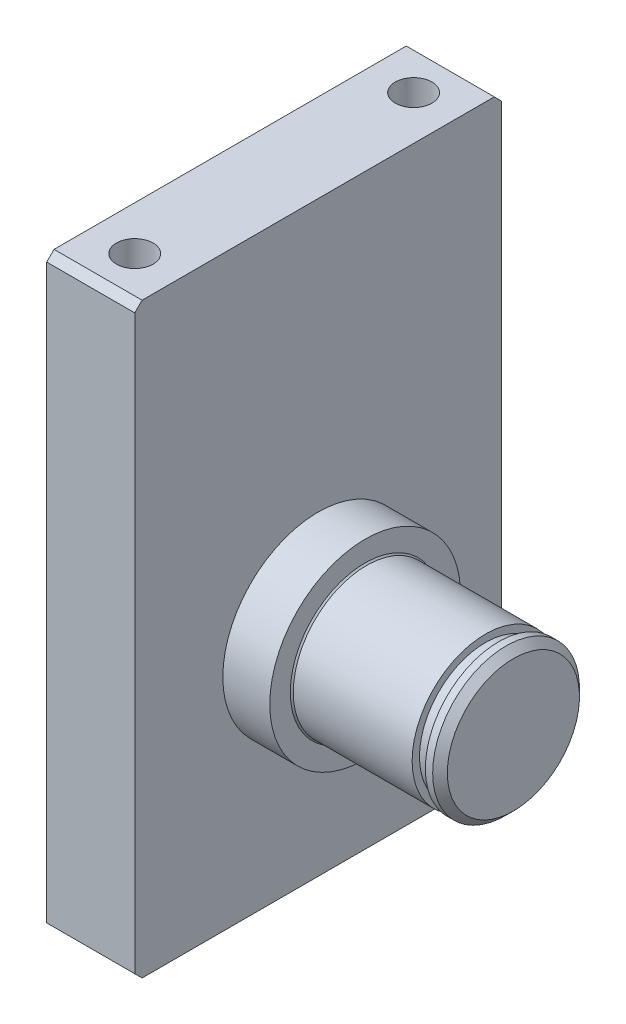
ISO-10303-21;
HEADER;
FILE_DESCRIPTION(('STEP AP214'),'2;1');
FILE_NAME('part.step','',(''),(''),'','','');
FILE_SCHEMA(('AUTOMOTIVE_DESIGN { 1 0 10303 214 1 1 1 1 }'));
ENDSEC;
DATA;
#1=APPLICATION_CONTEXT('core data for automotive mechanical design processes');
#2=APPLICATION_PROTOCOL_DEFINITION('international standard','automotive_design',2000,#1);
#3=PRODUCT_CONTEXT('',#1,'mechanical');
#4=PRODUCT('Part','Part','',(#3));
#5=PRODUCT_RELATED_PRODUCT_CATEGORY('part','',(#4));
#6=PRODUCT_DEFINITION_FORMATION('','',#4);
#7=PRODUCT_DEFINITION_CONTEXT('part definition',#1,'design');
#8=PRODUCT_DEFINITION('design','',#6,#7);
#9=PRODUCT_DEFINITION_SHAPE('','',#8);
#10=(LENGTH_UNIT() NAMED_UNIT(*) SI_UNIT(.MILLI.,.METRE.));
#11=(NAMED_UNIT(*) PLANE_ANGLE_UNIT() SI_UNIT($,.RADIAN.));
#12=(NAMED_UNIT(*) SI_UNIT($,.STERADIAN.) SOLID_ANGLE_UNIT());
#13=UNCERTAINTY_MEASURE_WITH_UNIT(LENGTH_MEASURE(1.E-05),#10,'distance_accuracy_value','');
#14=(GEOMETRIC_REPRESENTATION_CONTEXT(3) GLOBAL_UNCERTAINTY_ASSIGNED_CONTEXT((#13)) GLOBAL_UNIT_ASSIGNED_CONTEXT((#10,
#11,#12)) REPRESENTATION_CONTEXT('',''));
#15=CARTESIAN_POINT('',(0.,0.,0.));
#16=DIRECTION('',(0.,0.,1.));
#17=DIRECTION('',(1.,0.,0.));
#18=AXIS2_PLACEMENT_3D('',#15,#16,#17);
#19=CARTESIAN_POINT('',(19.3,0.,0.));
#20=DIRECTION('',(1.,0.,0.));
#21=DIRECTION('',(0.,0.,-1.));
#22=AXIS2_PLACEMENT_3D('',#19,#20,#21);
#23=PLANE('',#22);
#24=CARTESIAN_POINT('',(19.2999999999302,0.,0.));
#25=DIRECTION('',(-1.,0.,0.));
#26=DIRECTION('',(0.,0.,1.));
#27=AXIS2_PLACEMENT_3D('',#24,#25,#26);
#28=CIRCLE('',#27,4.50000000000728);
#29=CARTESIAN_POINT('',(19.2999999999302,0.,4.50000000000728));
#30=VERTEX_POINT('',#29);
#31=EDGE_CURVE('E20',#30,#30,#28,.T.);
#32=ORIENTED_EDGE('',*,*,#31,.F.);
#33=EDGE_LOOP('',(#32));
#34=FACE_BOUND('',#33,.T.);
#35=ADVANCED_FACE('F17',(#34),#23,.T.);
#36=CARTESIAN_POINT('',(18.8000000001125,0.,0.));
#37=DIRECTION('',(-1.,0.,0.));
#38=DIRECTION('',(0.,0.,1.));
#39=AXIS2_PLACEMENT_3D('',#36,#37,#38);
#40=CONICAL_SURFACE('',#39,4.99999999988177,0.785398163454292);
#41=ORIENTED_EDGE('',*,*,#31,.T.);
#42=EDGE_LOOP('',(#41));
#43=FACE_BOUND('',#42,.T.);
#44=CARTESIAN_POINT('',(18.8,0.,0.));
#45=DIRECTION('',(-1.,0.,0.));
#46=DIRECTION('',(0.,0.,1.));
#47=AXIS2_PLACEMENT_3D('',#44,#45,#46);
#48=CIRCLE('',#47,5.);
#49=CARTESIAN_POINT('',(18.8,0.,5.));
#50=VERTEX_POINT('',#49);
#51=EDGE_CURVE('E115',#50,#50,#48,.T.);
#52=ORIENTED_EDGE('',*,*,#51,.F.);
#53=EDGE_LOOP('',(#52));
#54=FACE_BOUND('',#53,.T.);
#55=ADVANCED_FACE('F167',(#43,#54),#40,.T.);
#56=CARTESIAN_POINT('',(19.3,0.,0.));
#57=DIRECTION('',(-1.,0.,0.));
#58=DIRECTION('',(0.,0.,1.));
#59=AXIS2_PLACEMENT_3D('',#56,#57,#58);
#60=CYLINDRICAL_SURFACE('',#59,5.);
#61=ORIENTED_EDGE('',*,*,#51,.T.);
#62=EDGE_LOOP('',(#61));
#63=FACE_BOUND('',#62,.T.);
#64=CARTESIAN_POINT('',(18.3,0.,0.));
#65=DIRECTION('',(-1.,0.,0.));
#66=DIRECTION('',(0.,0.,1.));
#67=AXIS2_PLACEMENT_3D('',#64,#65,#66);
#68=CIRCLE('',#67,5.);
#69=CARTESIAN_POINT('',(18.3,0.,5.));
#70=VERTEX_POINT('',#69);
#71=EDGE_CURVE('E118',#70,#70,#68,.F.);
#72=ORIENTED_EDGE('',*,*,#71,.T.);
#73=EDGE_LOOP('',(#72));
#74=FACE_BOUND('',#73,.T.);
#75=ADVANCED_FACE('F152',(#63,#74),#60,.T.);
#76=CARTESIAN_POINT('',(18.3,0.,0.));
#77=DIRECTION('',(1.,0.,0.));
#78=DIRECTION('',(0.,0.,-1.));
#79=AXIS2_PLACEMENT_3D('',#76,#77,#78);
#80=PLANE('',#79);
#81=CARTESIAN_POINT('',(18.3,0.,0.));
#82=DIRECTION('',(-1.,0.,0.));
#83=DIRECTION('',(0.,0.,1.));
#84=AXIS2_PLACEMENT_3D('',#81,#82,#83);
#85=CIRCLE('',#84,4.5);
#86=CARTESIAN_POINT('',(18.3,0.,4.5));
#87=VERTEX_POINT('',#86);
#88=EDGE_CURVE('E147',#87,#87,#85,.T.);
#89=ORIENTED_EDGE('',*,*,#88,.F.);
#90=EDGE_LOOP('',(#89));
#91=FACE_BOUND('',#90,.T.);
#92=ORIENTED_EDGE('',*,*,#71,.F.);
#93=EDGE_LOOP('',(#92));
#94=FACE_BOUND('',#93,.T.);
#95=ADVANCED_FACE('F154',(#91,#94),#80,.F.);
#96=CARTESIAN_POINT('',(18.3,0.,0.));
#97=DIRECTION('',(-1.,0.,0.));
#98=DIRECTION('',(0.,0.,1.));
#99=AXIS2_PLACEMENT_3D('',#96,#97,#98);
#100=CYLINDRICAL_SURFACE('',#99,4.5);
#101=CARTESIAN_POINT('',(17.4,0.,0.));
#102=DIRECTION('',(-1.,0.,0.));
#103=DIRECTION('',(0.,0.,1.));
#104=AXIS2_PLACEMENT_3D('',#101,#102,#103);
#105=CIRCLE('',#104,4.5);
#106=CARTESIAN_POINT('',(17.4,0.,4.5));
#107=VERTEX_POINT('',#106);
#108=EDGE_CURVE('E144',#107,#107,#105,.T.);
#109=ORIENTED_EDGE('',*,*,#108,.F.);
#110=EDGE_LOOP('',(#109));
#111=FACE_BOUND('',#110,.T.);
#112=ORIENTED_EDGE('',*,*,#88,.T.);
#113=EDGE_LOOP('',(#112));
#114=FACE_BOUND('',#113,.T.);
#115=ADVANCED_FACE('F156',(#111,#114),#100,.T.);
#116=CARTESIAN_POINT('',(17.4,0.,0.));
#117=DIRECTION('',(1.,0.,0.));
#118=DIRECTION('',(0.,0.,-1.));
#119=AXIS2_PLACEMENT_3D('',#116,#117,#118);
#120=PLANE('',#119);
#121=ORIENTED_EDGE('',*,*,#108,.T.);
#122=EDGE_LOOP('',(#121));
#123=FACE_BOUND('',#122,.T.);
#124=CARTESIAN_POINT('',(17.4,0.,0.));
#125=DIRECTION('',(-1.,0.,0.));
#126=DIRECTION('',(0.,0.,1.));
#127=AXIS2_PLACEMENT_3D('',#124,#125,#126);
#128=CIRCLE('',#127,5.);
#129=CARTESIAN_POINT('',(17.4,0.,5.));
#130=VERTEX_POINT('',#129);
#131=EDGE_CURVE('E114',#130,#130,#128,.T.);
#132=ORIENTED_EDGE('',*,*,#131,.F.);
#133=EDGE_LOOP('',(#132));
#134=FACE_BOUND('',#133,.T.);
#135=ADVANCED_FACE('F164',(#123,#134),#120,.T.);
#136=CARTESIAN_POINT('',(17.4,0.,0.));
#137=DIRECTION('',(-1.,0.,0.));
#138=DIRECTION('',(0.,0.,1.));
#139=AXIS2_PLACEMENT_3D('',#136,#137,#138);
#140=CYLINDRICAL_SURFACE('',#139,5.);
#141=ORIENTED_EDGE('',*,*,#131,.T.);
#142=EDGE_LOOP('',(#141));
#143=FACE_BOUND('',#142,.T.);
#144=CARTESIAN_POINT('',(9.29999999993925,0.,0.));
#145=DIRECTION('',(-1.,0.,0.));
#146=DIRECTION('',(0.,0.,1.));
#147=AXIS2_PLACEMENT_3D('',#144,#145,#146);
#148=CIRCLE('',#147,5.0000000000523);
#149=CARTESIAN_POINT('',(9.29999999993925,0.,5.0000000000523));
#150=VERTEX_POINT('',#149);
#151=EDGE_CURVE('E111',#150,#150,#148,.T.);
#152=ORIENTED_EDGE('',*,*,#151,.F.);
#153=EDGE_LOOP('',(#152));
#154=FACE_BOUND('',#153,.T.);
#155=ADVANCED_FACE('F248',(#143,#154),#140,.T.);
#156=CARTESIAN_POINT('',(9.20000000002119,0.,0.));
#157=DIRECTION('',(-1.,0.,0.));
#158=DIRECTION('',(0.,0.,1.));
#159=AXIS2_PLACEMENT_3D('',#156,#157,#158);
#160=CONICAL_SURFACE('',#159,5.09999999997035,0.785398163397448);
#161=ORIENTED_EDGE('',*,*,#151,.T.);
#162=EDGE_LOOP('',(#161));
#163=FACE_BOUND('',#162,.T.);
#164=CARTESIAN_POINT('',(9.20000000002119,0.,0.));
#165=DIRECTION('',(-1.,0.,0.));
#166=DIRECTION('',(0.,0.,1.));
#167=AXIS2_PLACEMENT_3D('',#164,#165,#166);
#168=CIRCLE('',#167,5.09999999997035);
#169=CARTESIAN_POINT('',(9.20000000002119,0.,5.09999999997035));
#170=VERTEX_POINT('',#169);
#171=EDGE_CURVE('E107',#170,#170,#168,.T.);
#172=ORIENTED_EDGE('',*,*,#171,.F.);
#173=EDGE_LOOP('',(#172));
#174=FACE_BOUND('',#173,.T.);
#175=ADVANCED_FACE('F244',(#163,#174),#160,.T.);
#176=CARTESIAN_POINT('',(9.2,0.,0.));
#177=DIRECTION('',(1.,0.,0.));
#178=DIRECTION('',(0.,0.,-1.));
#179=AXIS2_PLACEMENT_3D('',#176,#177,#178);
#180=PLANE('',#179);
#181=CARTESIAN_POINT('',(9.2,0.,0.));
#182=DIRECTION('',(-1.,0.,0.));
#183=DIRECTION('',(0.,0.,1.));
#184=AXIS2_PLACEMENT_3D('',#181,#182,#183);
#185=CIRCLE('',#184,6.5);
#186=CARTESIAN_POINT('',(9.2,0.,6.5));
#187=VERTEX_POINT('',#186);
#188=EDGE_CURVE('E101',#187,#187,#185,.T.);
#189=ORIENTED_EDGE('',*,*,#188,.F.);
#190=EDGE_LOOP('',(#189));
#191=FACE_BOUND('',#190,.T.);
#192=ORIENTED_EDGE('',*,*,#171,.T.);
#193=EDGE_LOOP('',(#192));
#194=FACE_BOUND('',#193,.T.);
#195=ADVANCED_FACE('F94',(#191,#194),#180,.T.);
#196=CARTESIAN_POINT('',(3.,16.499999999894,-9.5));
#197=DIRECTION('',(0.,1.,0.));
#198=DIRECTION('',(0.,0.,1.));
#199=AXIS2_PLACEMENT_3D('',#196,#197,#198);
#200=CONICAL_SURFACE('',#199,1.24999999985402,1.0297442584325);
#201=CARTESIAN_POINT('',(3.,15.7489242260453,-9.50000000011369));
#202=VERTEX_POINT('',#201);
#203=VERTEX_LOOP('',#202);
#204=FACE_BOUND('',#203,.T.);
#205=CARTESIAN_POINT('',(3.,16.5,-9.5));
#206=DIRECTION('',(0.,1.,0.));
#207=DIRECTION('',(0.,0.,1.));
#208=AXIS2_PLACEMENT_3D('',#205,#206,#207);
#209=CIRCLE('',#208,1.24999999999999);
#210=CARTESIAN_POINT('',(3.,16.5,-8.25000000000001));
#211=VERTEX_POINT('',#210);
#212=EDGE_CURVE('E98',#211,#211,#209,.T.);
#213=ORIENTED_EDGE('',*,*,#212,.T.);
#214=EDGE_LOOP('',(#213));
#215=FACE_BOUND('',#214,.T.);
#216=ADVANCED_FACE('F90',(#204,#215),#200,.F.);
#217=CARTESIAN_POINT('',(3.,16.4999999998372,9.5));
#218=DIRECTION('',(0.,1.,0.));
#219=DIRECTION('',(0.,0.,1.));
#220=AXIS2_PLACEMENT_3D('',#217,#218,#219);
#221=CONICAL_SURFACE('',#220,1.24999999980264,1.02974425839621);
#222=CARTESIAN_POINT('',(3.,15.7489242259885,9.49999999991474));
#223=VERTEX_POINT('',#222);
#224=VERTEX_LOOP('',#223);
#225=FACE_BOUND('',#224,.T.);
#226=CARTESIAN_POINT('',(3.,16.5,9.5));
#227=DIRECTION('',(0.,1.,0.));
#228=DIRECTION('',(0.,0.,1.));
#229=AXIS2_PLACEMENT_3D('',#226,#227,#228);
#230=CIRCLE('',#229,1.24999999999999);
#231=CARTESIAN_POINT('',(3.,16.5,10.75));
#232=VERTEX_POINT('',#231);
#233=EDGE_CURVE('E100',#232,#232,#230,.T.);
#234=ORIENTED_EDGE('',*,*,#233,.T.);
#235=EDGE_LOOP('',(#234));
#236=FACE_BOUND('',#235,.T.);
#237=ADVANCED_FACE('F93',(#225,#236),#221,.F.);
#238=CARTESIAN_POINT('',(3.,-6.50000000001683,-9.5));
#239=DIRECTION('',(0.,-1.,0.));
#240=DIRECTION('',(1.,0.,0.));
#241=AXIS2_PLACEMENT_3D('',#238,#239,#240);
#242=CONICAL_SURFACE('',#241,1.24999999997317,1.02974425866186);
#243=CARTESIAN_POINT('',(3.,-5.74892422622497,-9.5));
#244=VERTEX_POINT('',#243);
#245=VERTEX_LOOP('',#244);
#246=FACE_BOUND('',#245,.T.);
#247=CARTESIAN_POINT('',(3.,-6.5,-9.5));
#248=DIRECTION('',(0.,-1.,0.));
#249=DIRECTION('',(0.,0.,-1.));
#250=AXIS2_PLACEMENT_3D('',#247,#248,#249);
#251=CIRCLE('',#250,1.24999999999999);
#252=CARTESIAN_POINT('',(3.,-6.5,-10.75));
#253=VERTEX_POINT('',#252);
#254=EDGE_CURVE('E518',#253,#253,#251,.T.);
#255=ORIENTED_EDGE('',*,*,#254,.T.);
#256=EDGE_LOOP('',(#255));
#257=FACE_BOUND('',#256,.T.);
#258=ADVANCED_FACE('F235',(#246,#257),#242,.F.);
#259=CARTESIAN_POINT('',(3.,-6.50000000001683,9.5));
#260=DIRECTION('',(0.,-1.,0.));
#261=DIRECTION('',(1.,0.,0.));
#262=AXIS2_PLACEMENT_3D('',#259,#260,#261);
#263=CONICAL_SURFACE('',#262,1.2500000000814,1.02974425868194);
#264=CARTESIAN_POINT('',(3.,-5.74892422622497,9.5));
#265=VERTEX_POINT('',#264);
#266=VERTEX_LOOP('',#265);
#267=FACE_BOUND('',#266,.T.);
#268=CARTESIAN_POINT('',(3.,-6.5,9.5));
#269=DIRECTION('',(0.,-1.,0.));
#270=DIRECTION('',(0.,0.,-1.));
#271=AXIS2_PLACEMENT_3D('',#268,#269,#270);
#272=CIRCLE('',#271,1.24999999999999);
#273=CARTESIAN_POINT('',(3.,-6.5,8.25000000000001));
#274=VERTEX_POINT('',#273);
#275=EDGE_CURVE('E516',#274,#274,#272,.T.);
#276=ORIENTED_EDGE('',*,*,#275,.T.);
#277=EDGE_LOOP('',(#276));
#278=FACE_BOUND('',#277,.T.);
#279=ADVANCED_FACE('F231',(#267,#278),#263,.F.);
#280=CARTESIAN_POINT('',(9.2,0.,0.));
#281=DIRECTION('',(-1.,0.,0.));
#282=DIRECTION('',(0.,0.,1.));
#283=AXIS2_PLACEMENT_3D('',#280,#281,#282);
#284=CYLINDRICAL_SURFACE('',#283,6.5);
#285=ORIENTED_EDGE('',*,*,#188,.T.);
#286=EDGE_LOOP('',(#285));
#287=FACE_BOUND('',#286,.T.);
#288=CARTESIAN_POINT('',(6.,0.,0.));
#289=DIRECTION('',(-1.,0.,0.));
#290=DIRECTION('',(0.,0.,1.));
#291=AXIS2_PLACEMENT_3D('',#288,#289,#290);
#292=CIRCLE('',#291,6.5);
#293=CARTESIAN_POINT('',(6.,0.,6.5));
#294=VERTEX_POINT('',#293);
#295=EDGE_CURVE('E135',#294,#294,#292,.F.);
#296=ORIENTED_EDGE('',*,*,#295,.T.);
#297=EDGE_LOOP('',(#296));
#298=FACE_BOUND('',#297,.T.);
#299=ADVANCED_FACE('F228',(#287,#298),#284,.T.);
#300=CARTESIAN_POINT('',(3.,25.,-9.5));
#301=DIRECTION('',(0.,1.,0.));
#302=DIRECTION('',(0.,0.,1.));
#303=AXIS2_PLACEMENT_3D('',#300,#301,#302);
#304=CYLINDRICAL_SURFACE('',#303,1.24999999999999);
#305=ORIENTED_EDGE('',*,*,#212,.F.);
#306=EDGE_LOOP('',(#305));
#307=FACE_BOUND('',#306,.T.);
#308=CARTESIAN_POINT('',(3.,25.,-9.5));
#309=DIRECTION('',(0.,1.,0.));
#310=DIRECTION('',(0.,0.,1.));
#311=AXIS2_PLACEMENT_3D('',#308,#309,#310);
#312=CIRCLE('',#311,1.24999999999999);
#313=CARTESIAN_POINT('',(3.,25.,-8.25000000000001));
#314=VERTEX_POINT('',#313);
#315=EDGE_CURVE('E131',#314,#314,#312,.T.);
#316=ORIENTED_EDGE('',*,*,#315,.T.);
#317=EDGE_LOOP('',(#316));
#318=FACE_BOUND('',#317,.T.);
#319=ADVANCED_FACE('F224',(#307,#318),#304,.F.);
#320=CARTESIAN_POINT('',(3.,25.,9.5));
#321=DIRECTION('',(0.,1.,0.));
#322=DIRECTION('',(0.,0.,1.));
#323=AXIS2_PLACEMENT_3D('',#320,#321,#322);
#324=CYLINDRICAL_SURFACE('',#323,1.24999999999999);
#325=ORIENTED_EDGE('',*,*,#233,.F.);
#326=EDGE_LOOP('',(#325));
#327=FACE_BOUND('',#326,.T.);
#328=CARTESIAN_POINT('',(3.,25.,9.5));
#329=DIRECTION('',(0.,1.,0.));
#330=DIRECTION('',(0.,0.,1.));
#331=AXIS2_PLACEMENT_3D('',#328,#329,#330);
#332=CIRCLE('',#331,1.24999999999999);
#333=CARTESIAN_POINT('',(3.,25.,10.75));
#334=VERTEX_POINT('',#333);
#335=EDGE_CURVE('E127',#334,#334,#332,.T.);
#336=ORIENTED_EDGE('',*,*,#335,.T.);
#337=EDGE_LOOP('',(#336));
#338=FACE_BOUND('',#337,.T.);
#339=ADVANCED_FACE('F220',(#327,#338),#324,.F.);
#340=CARTESIAN_POINT('',(6.,25.,-12.));
#341=DIRECTION('',(0.,-0.707106781186545,0.70710678118655));
#342=DIRECTION('',(0.,-0.70710678118655,-0.707106781186545));
#343=AXIS2_PLACEMENT_3D('',#340,#341,#342);
#344=PLANE('',#343);
#345=DIRECTION('',(1.,0.,0.));
#346=VECTOR('',#345,1.);
#347=CARTESIAN_POINT('',(6.,24.5,-12.5));
#348=LINE('',#347,#346);
#349=CARTESIAN_POINT('',(6.,24.5,-12.5));
#350=VERTEX_POINT('',#349);
#351=CARTESIAN_POINT('',(0.,24.5,-12.5));
#352=VERTEX_POINT('',#351);
#353=EDGE_CURVE('E126',#350,#352,#348,.F.);
#354=ORIENTED_EDGE('',*,*,#353,.T.);
#355=DIRECTION('',(0.,-0.70710678118655,-0.707106781186545));
#356=VECTOR('',#355,1.);
#357=CARTESIAN_POINT('',(0.,25.,-12.));
#358=LINE('',#357,#356);
#359=CARTESIAN_POINT('',(0.,25.,-12.));
#360=VERTEX_POINT('',#359);
#361=EDGE_CURVE('E104',#360,#352,#358,.T.);
#362=ORIENTED_EDGE('',*,*,#361,.F.);
#363=DIRECTION('',(1.,0.,0.));
#364=VECTOR('',#363,1.);
#365=CARTESIAN_POINT('',(6.,25.,-12.));
#366=LINE('',#365,#364);
#367=CARTESIAN_POINT('',(6.,25.,-12.));
#368=VERTEX_POINT('',#367);
#369=EDGE_CURVE('E499',#360,#368,#366,.T.);
#370=ORIENTED_EDGE('',*,*,#369,.T.);
#371=DIRECTION('',(0.,-0.70710678118655,-0.707106781186545));
#372=VECTOR('',#371,1.);
#373=CARTESIAN_POINT('',(6.,25.,-12.));
#374=LINE('',#373,#372);
#375=EDGE_CURVE('E138',#368,#350,#374,.T.);
#376=ORIENTED_EDGE('',*,*,#375,.T.);
#377=EDGE_LOOP('',(#354,#362,#370,#376));
#378=FACE_BOUND('',#377,.T.);
#379=ADVANCED_FACE('F216',(#378),#344,.F.);
#380=CARTESIAN_POINT('',(3.,-15.,-9.5));
#381=DIRECTION('',(0.,-1.,0.));
#382=DIRECTION('',(0.,0.,-1.));
#383=AXIS2_PLACEMENT_3D('',#380,#381,#382);
#384=CYLINDRICAL_SURFACE('',#383,1.24999999999999);
#385=ORIENTED_EDGE('',*,*,#254,.F.);
#386=EDGE_LOOP('',(#385));
#387=FACE_BOUND('',#386,.T.);
#388=CARTESIAN_POINT('',(3.,-15.,-9.5));
#389=DIRECTION('',(0.,-1.,0.));
#390=DIRECTION('',(0.,0.,-1.));
#391=AXIS2_PLACEMENT_3D('',#388,#389,#390);
#392=CIRCLE('',#391,1.24999999999999);
#393=CARTESIAN_POINT('',(3.,-15.,-10.75));
#394=VERTEX_POINT('',#393);
#395=EDGE_CURVE('E123',#394,#394,#392,.T.);
#396=ORIENTED_EDGE('',*,*,#395,.T.);
#397=EDGE_LOOP('',(#396));
#398=FACE_BOUND('',#397,.T.);
#399=ADVANCED_FACE('F212',(#387,#398),#384,.F.);
#400=CARTESIAN_POINT('',(3.,-15.,9.5));
#401=DIRECTION('',(0.,-1.,0.));
#402=DIRECTION('',(0.,0.,-1.));
#403=AXIS2_PLACEMENT_3D('',#400,#401,#402);
#404=CYLINDRICAL_SURFACE('',#403,1.24999999999999);
#405=ORIENTED_EDGE('',*,*,#275,.F.);
#406=EDGE_LOOP('',(#405));
#407=FACE_BOUND('',#406,.T.);
#408=CARTESIAN_POINT('',(3.,-15.,9.5));
#409=DIRECTION('',(0.,-1.,0.));
#410=DIRECTION('',(0.,0.,-1.));
#411=AXIS2_PLACEMENT_3D('',#408,#409,#410);
#412=CIRCLE('',#411,1.24999999999999);
#413=CARTESIAN_POINT('',(3.,-15.,8.25000000000001));
#414=VERTEX_POINT('',#413);
#415=EDGE_CURVE('E119',#414,#414,#412,.T.);
#416=ORIENTED_EDGE('',*,*,#415,.T.);
#417=EDGE_LOOP('',(#416));
#418=FACE_BOUND('',#417,.T.);
#419=ADVANCED_FACE('F208',(#407,#418),#404,.F.);
#420=CARTESIAN_POINT('',(6.,-14.5,-12.5));
#421=DIRECTION('',(0.,0.707106781186548,0.707106781186548));
#422=DIRECTION('',(0.,-0.707106781186548,0.707106781186548));
#423=AXIS2_PLACEMENT_3D('',#420,#421,#422);
#424=PLANE('',#423);
#425=DIRECTION('',(1.,0.,0.));
#426=VECTOR('',#425,1.);
#427=CARTESIAN_POINT('',(6.,-15.,-12.));
#428=LINE('',#427,#426);
#429=CARTESIAN_POINT('',(6.,-15.,-12.));
#430=VERTEX_POINT('',#429);
#431=CARTESIAN_POINT('',(0.,-15.,-12.));
#432=VERTEX_POINT('',#431);
#433=EDGE_CURVE('E549',#430,#432,#428,.F.);
#434=ORIENTED_EDGE('',*,*,#433,.T.);
#435=DIRECTION('',(0.,-0.707106781186548,0.707106781186548));
#436=VECTOR('',#435,1.);
#437=CARTESIAN_POINT('',(0.,-14.5,-12.5));
#438=LINE('',#437,#436);
#439=CARTESIAN_POINT('',(0.,-14.5,-12.5));
#440=VERTEX_POINT('',#439);
#441=EDGE_CURVE('E514',#440,#432,#438,.T.);
#442=ORIENTED_EDGE('',*,*,#441,.F.);
#443=DIRECTION('',(1.,0.,0.));
#444=VECTOR('',#443,1.);
#445=CARTESIAN_POINT('',(6.,-14.5,-12.5));
#446=LINE('',#445,#444);
#447=CARTESIAN_POINT('',(6.,-14.5,-12.5));
#448=VERTEX_POINT('',#447);
#449=EDGE_CURVE('E501',#440,#448,#446,.T.);
#450=ORIENTED_EDGE('',*,*,#449,.T.);
#451=DIRECTION('',(0.,-0.707106781186547,0.707106781186547));
#452=VECTOR('',#451,1.);
#453=CARTESIAN_POINT('',(6.,-14.5,-12.5));
#454=LINE('',#453,#452);
#455=EDGE_CURVE('E511',#448,#430,#454,.T.);
#456=ORIENTED_EDGE('',*,*,#455,.T.);
#457=EDGE_LOOP('',(#434,#442,#450,#456));
#458=FACE_BOUND('',#457,.T.);
#459=ADVANCED_FACE('F205',(#458),#424,.F.);
#460=CARTESIAN_POINT('',(6.,24.5,12.5));
#461=DIRECTION('',(0.,-0.707106781186548,-0.707106781186548));
#462=DIRECTION('',(0.,0.707106781186548,-0.707106781186548));
#463=AXIS2_PLACEMENT_3D('',#460,#461,#462);
#464=PLANE('',#463);
#465=DIRECTION('',(1.,0.,0.));
#466=VECTOR('',#465,1.);
#467=CARTESIAN_POINT('',(6.,25.,12.));
#468=LINE('',#467,#466);
#469=CARTESIAN_POINT('',(6.,25.,12.));
#470=VERTEX_POINT('',#469);
#471=CARTESIAN_POINT('',(0.,25.,12.));
#472=VERTEX_POINT('',#471);
#473=EDGE_CURVE('E130',#470,#472,#468,.F.);
#474=ORIENTED_EDGE('',*,*,#473,.T.);
#475=DIRECTION('',(0.,0.707106781186548,-0.707106781186548));
#476=VECTOR('',#475,1.);
#477=CARTESIAN_POINT('',(0.,24.5,12.5));
#478=LINE('',#477,#476);
#479=CARTESIAN_POINT('',(0.,24.5,12.5));
#480=VERTEX_POINT('',#479);
#481=EDGE_CURVE('E35',#480,#472,#478,.T.);
#482=ORIENTED_EDGE('',*,*,#481,.F.);
#483=DIRECTION('',(-1.,0.,0.));
#484=VECTOR('',#483,1.);
#485=CARTESIAN_POINT('',(6.,24.5,12.5));
#486=LINE('',#485,#484);
#487=CARTESIAN_POINT('',(6.,24.5,12.5));
#488=VERTEX_POINT('',#487);
#489=EDGE_CURVE('E547',#480,#488,#486,.F.);
#490=ORIENTED_EDGE('',*,*,#489,.T.);
#491=DIRECTION('',(0.,0.707106781186547,-0.707106781186547));
#492=VECTOR('',#491,1.);
#493=CARTESIAN_POINT('',(6.,24.5,12.5));
#494=LINE('',#493,#492);
#495=EDGE_CURVE('E494',#488,#470,#494,.T.);
#496=ORIENTED_EDGE('',*,*,#495,.T.);
#497=EDGE_LOOP('',(#474,#482,#490,#496));
#498=FACE_BOUND('',#497,.T.);
#499=ADVANCED_FACE('F201',(#498),#464,.F.);
#500=CARTESIAN_POINT('',(6.,0.,0.));
#501=DIRECTION('',(-1.,0.,0.));
#502=DIRECTION('',(0.,0.,1.));
#503=AXIS2_PLACEMENT_3D('',#500,#501,#502);
#504=PLANE('',#503);
#505=ORIENTED_EDGE('',*,*,#295,.F.);
#506=EDGE_LOOP('',(#505));
#507=FACE_BOUND('',#506,.T.);
#508=ORIENTED_EDGE('',*,*,#375,.F.);
#509=DIRECTION('',(0.,0.,-1.));
#510=VECTOR('',#509,1.);
#511=CARTESIAN_POINT('',(6.,25.,12.5));
#512=LINE('',#511,#510);
#513=EDGE_CURVE('E487',#368,#470,#512,.F.);
#514=ORIENTED_EDGE('',*,*,#513,.T.);
#515=ORIENTED_EDGE('',*,*,#495,.F.);
#516=DIRECTION('',(0.,1.,0.));
#517=VECTOR('',#516,1.);
#518=CARTESIAN_POINT('',(6.,-15.,12.5));
#519=LINE('',#518,#517);
#520=CARTESIAN_POINT('',(6.,-14.5,12.5));
#521=VERTEX_POINT('',#520);
#522=EDGE_CURVE('E545',#488,#521,#519,.F.);
#523=ORIENTED_EDGE('',*,*,#522,.T.);
#524=DIRECTION('',(0.,0.707106781186548,0.707106781186548));
#525=VECTOR('',#524,1.);
#526=CARTESIAN_POINT('',(6.,-15.,12.));
#527=LINE('',#526,#525);
#528=CARTESIAN_POINT('',(6.,-15.,12.));
#529=VERTEX_POINT('',#528);
#530=EDGE_CURVE('E134',#521,#529,#527,.F.);
#531=ORIENTED_EDGE('',*,*,#530,.T.);
#532=DIRECTION('',(0.,0.,1.));
#533=VECTOR('',#532,1.);
#534=CARTESIAN_POINT('',(6.,-15.,12.5));
#535=LINE('',#534,#533);
#536=EDGE_CURVE('E552',#529,#430,#535,.F.);
#537=ORIENTED_EDGE('',*,*,#536,.T.);
#538=ORIENTED_EDGE('',*,*,#455,.F.);
#539=DIRECTION('',(0.,1.,0.));
#540=VECTOR('',#539,1.);
#541=CARTESIAN_POINT('',(6.,-15.,-12.5));
#542=LINE('',#541,#540);
#543=EDGE_CURVE('E491',#448,#350,#542,.T.);
#544=ORIENTED_EDGE('',*,*,#543,.T.);
#545=EDGE_LOOP('',(#508,#514,#515,#523,#531,#537,#538,#544));
#546=FACE_BOUND('',#545,.T.);
#547=ADVANCED_FACE('F197',(#507,#546),#504,.F.);
#548=CARTESIAN_POINT('',(6.,-15.,12.));
#549=DIRECTION('',(0.,0.707106781186548,-0.707106781186548));
#550=DIRECTION('',(0.,0.707106781186548,0.707106781186548));
#551=AXIS2_PLACEMENT_3D('',#548,#549,#550);
#552=PLANE('',#551);
#553=DIRECTION('',(-1.,0.,0.));
#554=VECTOR('',#553,1.);
#555=CARTESIAN_POINT('',(6.,-14.5,12.5));
#556=LINE('',#555,#554);
#557=CARTESIAN_POINT('',(0.,-14.5,12.5));
#558=VERTEX_POINT('',#557);
#559=EDGE_CURVE('E540',#521,#558,#556,.T.);
#560=ORIENTED_EDGE('',*,*,#559,.T.);
#561=DIRECTION('',(0.,0.707106781186548,0.707106781186548));
#562=VECTOR('',#561,1.);
#563=CARTESIAN_POINT('',(0.,-15.,12.));
#564=LINE('',#563,#562);
#565=CARTESIAN_POINT('',(0.,-15.,12.));
#566=VERTEX_POINT('',#565);
#567=EDGE_CURVE('E137',#566,#558,#564,.T.);
#568=ORIENTED_EDGE('',*,*,#567,.F.);
#569=DIRECTION('',(1.,0.,0.));
#570=VECTOR('',#569,1.);
#571=CARTESIAN_POINT('',(6.,-15.,12.));
#572=LINE('',#571,#570);
#573=EDGE_CURVE('E122',#566,#529,#572,.T.);
#574=ORIENTED_EDGE('',*,*,#573,.T.);
#575=ORIENTED_EDGE('',*,*,#530,.F.);
#576=EDGE_LOOP('',(#560,#568,#574,#575));
#577=FACE_BOUND('',#576,.T.);
#578=ADVANCED_FACE('F193',(#577),#552,.F.);
#579=CARTESIAN_POINT('',(6.,25.,12.5));
#580=DIRECTION('',(0.,-1.,0.));
#581=DIRECTION('',(0.,0.,-1.));
#582=AXIS2_PLACEMENT_3D('',#579,#580,#581);
#583=PLANE('',#582);
#584=ORIENTED_EDGE('',*,*,#369,.F.);
#585=DIRECTION('',(0.,0.,1.));
#586=VECTOR('',#585,1.);
#587=CARTESIAN_POINT('',(0.,25.,0.));
#588=LINE('',#587,#586);
#589=EDGE_CURVE('E534',#472,#360,#588,.F.);
#590=ORIENTED_EDGE('',*,*,#589,.F.);
#591=ORIENTED_EDGE('',*,*,#473,.F.);
#592=ORIENTED_EDGE('',*,*,#513,.F.);
#593=EDGE_LOOP('',(#584,#590,#591,#592));
#594=FACE_BOUND('',#593,.T.);
#595=ORIENTED_EDGE('',*,*,#335,.F.);
#596=EDGE_LOOP('',(#595));
#597=FACE_BOUND('',#596,.T.);
#598=ORIENTED_EDGE('',*,*,#315,.F.);
#599=EDGE_LOOP('',(#598));
#600=FACE_BOUND('',#599,.T.);
#601=ADVANCED_FACE('F189',(#594,#597,#600),#583,.F.);
#602=CARTESIAN_POINT('',(6.,-15.,-12.5));
#603=DIRECTION('',(0.,0.,1.));
#604=DIRECTION('',(1.,0.,0.));
#605=AXIS2_PLACEMENT_3D('',#602,#603,#604);
#606=PLANE('',#605);
#607=ORIENTED_EDGE('',*,*,#353,.F.);
#608=ORIENTED_EDGE('',*,*,#543,.F.);
#609=ORIENTED_EDGE('',*,*,#449,.F.);
#610=DIRECTION('',(0.,1.,0.));
#611=VECTOR('',#610,1.);
#612=CARTESIAN_POINT('',(0.,0.,-12.5));
#613=LINE('',#612,#611);
#614=EDGE_CURVE('E533',#352,#440,#613,.F.);
#615=ORIENTED_EDGE('',*,*,#614,.F.);
#616=EDGE_LOOP('',(#607,#608,#609,#615));
#617=FACE_BOUND('',#616,.T.);
#618=ADVANCED_FACE('F185',(#617),#606,.F.);
#619=CARTESIAN_POINT('',(6.,-15.,12.5));
#620=DIRECTION('',(0.,1.,0.));
#621=DIRECTION('',(0.,0.,1.));
#622=AXIS2_PLACEMENT_3D('',#619,#620,#621);
#623=PLANE('',#622);
#624=ORIENTED_EDGE('',*,*,#433,.F.);
#625=ORIENTED_EDGE('',*,*,#536,.F.);
#626=ORIENTED_EDGE('',*,*,#573,.F.);
#627=DIRECTION('',(0.,0.,1.));
#628=VECTOR('',#627,1.);
#629=CARTESIAN_POINT('',(0.,-15.,0.));
#630=LINE('',#629,#628);
#631=EDGE_CURVE('E26',#432,#566,#630,.T.);
#632=ORIENTED_EDGE('',*,*,#631,.F.);
#633=EDGE_LOOP('',(#624,#625,#626,#632));
#634=FACE_BOUND('',#633,.T.);
#635=ORIENTED_EDGE('',*,*,#415,.F.);
#636=EDGE_LOOP('',(#635));
#637=FACE_BOUND('',#636,.T.);
#638=ORIENTED_EDGE('',*,*,#395,.F.);
#639=EDGE_LOOP('',(#638));
#640=FACE_BOUND('',#639,.T.);
#641=ADVANCED_FACE('F179',(#634,#637,#640),#623,.F.);
#642=CARTESIAN_POINT('',(6.,-15.,12.5));
#643=DIRECTION('',(0.,0.,-1.));
#644=DIRECTION('',(-1.,0.,0.));
#645=AXIS2_PLACEMENT_3D('',#642,#643,#644);
#646=PLANE('',#645);
#647=ORIENTED_EDGE('',*,*,#559,.F.);
#648=ORIENTED_EDGE('',*,*,#522,.F.);
#649=ORIENTED_EDGE('',*,*,#489,.F.);
#650=DIRECTION('',(0.,1.,0.));
#651=VECTOR('',#650,1.);
#652=CARTESIAN_POINT('',(0.,0.,12.5));
#653=LINE('',#652,#651);
#654=EDGE_CURVE('E11',#558,#480,#653,.T.);
#655=ORIENTED_EDGE('',*,*,#654,.F.);
#656=EDGE_LOOP('',(#647,#648,#649,#655));
#657=FACE_BOUND('',#656,.T.);
#658=ADVANCED_FACE('F173',(#657),#646,.F.);
#659=CARTESIAN_POINT('',(0.,0.,0.));
#660=DIRECTION('',(-1.,0.,0.));
#661=DIRECTION('',(0.,0.,1.));
#662=AXIS2_PLACEMENT_3D('',#659,#660,#661);
#663=PLANE('',#662);
#664=ORIENTED_EDGE('',*,*,#654,.T.);
#665=ORIENTED_EDGE('',*,*,#481,.T.);
#666=ORIENTED_EDGE('',*,*,#589,.T.);
#667=ORIENTED_EDGE('',*,*,#361,.T.);
#668=ORIENTED_EDGE('',*,*,#614,.T.);
#669=ORIENTED_EDGE('',*,*,#441,.T.);
#670=ORIENTED_EDGE('',*,*,#631,.T.);
#671=ORIENTED_EDGE('',*,*,#567,.T.);
#672=EDGE_LOOP('',(#664,#665,#666,#667,#668,#669,#670,#671));
#673=FACE_BOUND('',#672,.T.);
#674=ADVANCED_FACE('F171',(#673),#663,.T.);
#675=CLOSED_SHELL('',(#35,#55,#75,#95,#115,#135,#155,#175,#195,#216,#237,#258,#279,#299,#319,
#339,#379,#399,#419,#459,#499,#547,#578,#601,#618,#641,#658,#674));
#676=MANIFOLD_SOLID_BREP('B1',#675);
#677=ADVANCED_BREP_SHAPE_REPRESENTATION('',(#18,#676),#14);
#678=SHAPE_DEFINITION_REPRESENTATION(#9,#677);
ENDSEC;
END-ISO-10303-21;
